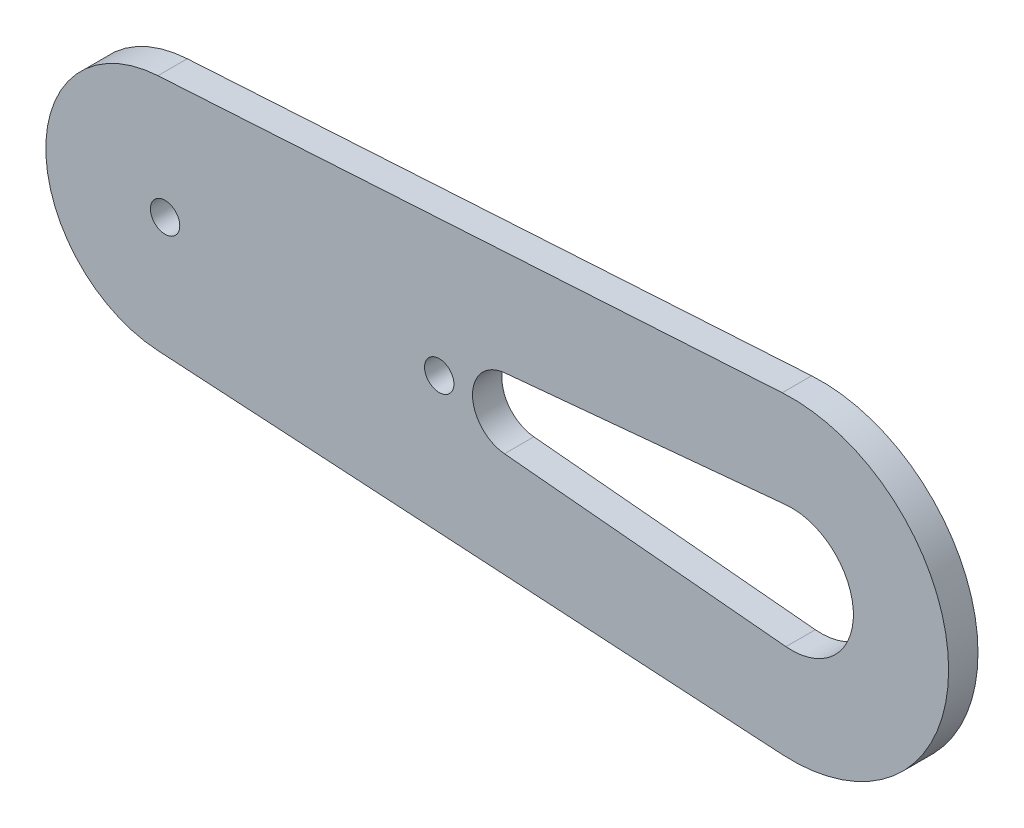
ISO-10303-21;
HEADER;
FILE_DESCRIPTION(('STEP AP214'),'2;1');
FILE_NAME('part.step','',(''),(''),'','','');
FILE_SCHEMA(('AUTOMOTIVE_DESIGN { 1 0 10303 214 1 1 1 1 }'));
ENDSEC;
DATA;
#1=APPLICATION_CONTEXT('core data for automotive mechanical design processes');
#2=APPLICATION_PROTOCOL_DEFINITION('international standard','automotive_design',2000,#1);
#3=PRODUCT_CONTEXT('',#1,'mechanical');
#4=PRODUCT('Part','Part','',(#3));
#5=PRODUCT_RELATED_PRODUCT_CATEGORY('part','',(#4));
#6=PRODUCT_DEFINITION_FORMATION('','',#4);
#7=PRODUCT_DEFINITION_CONTEXT('part definition',#1,'design');
#8=PRODUCT_DEFINITION('design','',#6,#7);
#9=PRODUCT_DEFINITION_SHAPE('','',#8);
#10=(LENGTH_UNIT() NAMED_UNIT(*) SI_UNIT(.MILLI.,.METRE.));
#11=(NAMED_UNIT(*) PLANE_ANGLE_UNIT() SI_UNIT($,.RADIAN.));
#12=(NAMED_UNIT(*) SI_UNIT($,.STERADIAN.) SOLID_ANGLE_UNIT());
#13=UNCERTAINTY_MEASURE_WITH_UNIT(LENGTH_MEASURE(1.E-05),#10,'distance_accuracy_value','');
#14=(GEOMETRIC_REPRESENTATION_CONTEXT(3) GLOBAL_UNCERTAINTY_ASSIGNED_CONTEXT((#13)) GLOBAL_UNIT_ASSIGNED_CONTEXT((#10,
#11,#12)) REPRESENTATION_CONTEXT('',''));
#15=CARTESIAN_POINT('',(0.,0.,0.));
#16=DIRECTION('',(0.,0.,1.));
#17=DIRECTION('',(1.,0.,0.));
#18=AXIS2_PLACEMENT_3D('',#15,#16,#17);
#19=CARTESIAN_POINT('',(47.1284914643076,-28.3132739904824,3.));
#20=DIRECTION('',(0.0601086862305752,0.998191838195261,0.));
#21=DIRECTION('',(-0.998191838195261,0.0601086862305752,0.));
#22=AXIS2_PLACEMENT_3D('',#19,#20,#21);
#23=PLANE('',#22);
#24=DIRECTION('',(0.998191838195261,-0.0601086862305752,0.));
#25=VECTOR('',#24,1.);
#26=CARTESIAN_POINT('',(47.1284914643076,-28.3132739904824,3.));
#27=LINE('',#26,#25);
#28=CARTESIAN_POINT('',(-16.640273069429,-24.4732739904824,3.));
#29=VERTEX_POINT('',#28);
#30=CARTESIAN_POINT('',(47.1284914643076,-28.3132739904824,3.));
#31=VERTEX_POINT('',#30);
#32=EDGE_CURVE('E120',#29,#31,#27,.T.);
#33=ORIENTED_EDGE('',*,*,#32,.F.);
#34=DIRECTION('',(0.,0.,-1.));
#35=VECTOR('',#34,1.);
#36=CARTESIAN_POINT('',(-16.640273069429,-24.4732739904824,3.));
#37=LINE('',#36,#35);
#38=CARTESIAN_POINT('',(-16.640273069429,-24.4732739904824,0.));
#39=VERTEX_POINT('',#38);
#40=EDGE_CURVE('E107',#29,#39,#37,.T.);
#41=ORIENTED_EDGE('',*,*,#40,.T.);
#42=DIRECTION('',(0.998191838195261,-0.0601086862305752,0.));
#43=VECTOR('',#42,1.);
#44=CARTESIAN_POINT('',(47.1284914643076,-28.3132739904824,0.));
#45=LINE('',#44,#43);
#46=CARTESIAN_POINT('',(47.1284914643076,-28.3132739904824,0.));
#47=VERTEX_POINT('',#46);
#48=EDGE_CURVE('E143',#39,#47,#45,.T.);
#49=ORIENTED_EDGE('',*,*,#48,.T.);
#50=DIRECTION('',(0.,0.,-1.));
#51=VECTOR('',#50,1.);
#52=CARTESIAN_POINT('',(47.1284914643076,-28.3132739904824,3.));
#53=LINE('',#52,#51);
#54=EDGE_CURVE('E11',#31,#47,#53,.T.);
#55=ORIENTED_EDGE('',*,*,#54,.F.);
#56=EDGE_LOOP('',(#33,#41,#49,#55));
#57=FACE_BOUND('',#56,.T.);
#58=ADVANCED_FACE('F44',(#57),#23,.F.);
#59=CARTESIAN_POINT('',(48.0919725737385,-12.3132739904824,3.));
#60=DIRECTION('',(0.,0.,-1.));
#61=DIRECTION('',(-1.,0.,0.));
#62=AXIS2_PLACEMENT_3D('',#59,#60,#61);
#63=CYLINDRICAL_SURFACE('',#62,16.02898299482);
#64=CARTESIAN_POINT('',(48.0919725737385,-12.3132739904824,0.));
#65=DIRECTION('',(0.,0.,1.));
#66=DIRECTION('',(-1.,0.,0.));
#67=AXIS2_PLACEMENT_3D('',#64,#65,#66);
#68=CIRCLE('',#67,16.02898299482);
#69=CARTESIAN_POINT('',(47.1284914643076,3.68672600951756,0.));
#70=VERTEX_POINT('',#69);
#71=EDGE_CURVE('E135',#47,#70,#68,.T.);
#72=ORIENTED_EDGE('',*,*,#71,.T.);
#73=DIRECTION('',(0.,0.,-1.));
#74=VECTOR('',#73,1.);
#75=CARTESIAN_POINT('',(47.1284914643076,3.68672600951756,3.));
#76=LINE('',#75,#74);
#77=CARTESIAN_POINT('',(47.1284914643076,3.68672600951756,3.));
#78=VERTEX_POINT('',#77);
#79=EDGE_CURVE('E52',#78,#70,#76,.T.);
#80=ORIENTED_EDGE('',*,*,#79,.F.);
#81=CARTESIAN_POINT('',(48.0919725737385,-12.3132739904824,3.));
#82=DIRECTION('',(0.,0.,1.));
#83=DIRECTION('',(-1.,0.,0.));
#84=AXIS2_PLACEMENT_3D('',#81,#82,#83);
#85=CIRCLE('',#84,16.02898299482);
#86=EDGE_CURVE('E128',#31,#78,#85,.T.);
#87=ORIENTED_EDGE('',*,*,#86,.F.);
#88=ORIENTED_EDGE('',*,*,#54,.T.);
#89=EDGE_LOOP('',(#72,#80,#87,#88));
#90=FACE_BOUND('',#89,.T.);
#91=ADVANCED_FACE('F237',(#90),#63,.T.);
#92=CARTESIAN_POINT('',(-52.5102031196558,-2.31327399048244,3.));
#93=DIRECTION('',(0.0601086862305751,-0.998191838195261,0.));
#94=DIRECTION('',(0.998191838195261,0.0601086862305751,0.));
#95=AXIS2_PLACEMENT_3D('',#92,#93,#94);
#96=PLANE('',#95);
#97=DIRECTION('',(-0.998191838195261,-0.0601086862305751,0.));
#98=VECTOR('',#97,1.);
#99=CARTESIAN_POINT('',(-52.5102031196558,-2.31327399048244,0.));
#100=LINE('',#99,#98);
#101=CARTESIAN_POINT('',(-16.640273069429,-0.15327399048244,0.));
#102=VERTEX_POINT('',#101);
#103=EDGE_CURVE('E129',#70,#102,#100,.T.);
#104=ORIENTED_EDGE('',*,*,#103,.T.);
#105=DIRECTION('',(0.,0.,-1.));
#106=VECTOR('',#105,1.);
#107=CARTESIAN_POINT('',(-16.640273069429,-0.15327399048244,3.));
#108=LINE('',#107,#106);
#109=CARTESIAN_POINT('',(-16.640273069429,-0.15327399048244,3.));
#110=VERTEX_POINT('',#109);
#111=EDGE_CURVE('E59',#110,#102,#108,.T.);
#112=ORIENTED_EDGE('',*,*,#111,.F.);
#113=DIRECTION('',(-0.998191838195261,-0.0601086862305751,0.));
#114=VECTOR('',#113,1.);
#115=CARTESIAN_POINT('',(-52.5102031196558,-2.31327399048244,3.));
#116=LINE('',#115,#114);
#117=EDGE_CURVE('E123',#78,#110,#116,.T.);
#118=ORIENTED_EDGE('',*,*,#117,.F.);
#119=ORIENTED_EDGE('',*,*,#79,.T.);
#120=EDGE_LOOP('',(#104,#112,#118,#119));
#121=FACE_BOUND('',#120,.T.);
#122=ADVANCED_FACE('F153',(#121),#96,.F.);
#123=CARTESIAN_POINT('',(-51.9080274262615,-12.3132739904824,3.));
#124=DIRECTION('',(0.,0.,-1.));
#125=DIRECTION('',(-1.,0.,0.));
#126=AXIS2_PLACEMENT_3D('',#123,#124,#125);
#127=PLANE('',#126);
#128=DIRECTION('',(0.995656440705901,-0.093103448275862,0.));
#129=VECTOR('',#128,1.);
#130=CARTESIAN_POINT('',(47.5054208496005,-18.5859095669296,3.));
#131=LINE('',#130,#129);
#132=CARTESIAN_POINT('',(18.7568001599454,-15.8976371770237,3.));
#133=VERTEX_POINT('',#132);
#134=CARTESIAN_POINT('',(47.5054208496005,-18.5859095669296,3.));
#135=VERTEX_POINT('',#134);
#136=EDGE_CURVE('E184',#133,#135,#131,.T.);
#137=ORIENTED_EDGE('',*,*,#136,.F.);
#138=CARTESIAN_POINT('',(19.0919725737385,-12.3132739904824,3.));
#139=DIRECTION('',(0.,0.,1.));
#140=DIRECTION('',(-1.,0.,0.));
#141=AXIS2_PLACEMENT_3D('',#138,#139,#140);
#142=CIRCLE('',#141,3.6);
#143=CARTESIAN_POINT('',(18.7568001599454,-8.72891080394119,3.));
#144=VERTEX_POINT('',#143);
#145=EDGE_CURVE('E67',#144,#133,#142,.T.);
#146=ORIENTED_EDGE('',*,*,#145,.F.);
#147=DIRECTION('',(-0.995656440705901,-0.0931034482758623,0.));
#148=VECTOR('',#147,1.);
#149=CARTESIAN_POINT('',(18.7568001599454,-8.72891080394119,3.));
#150=LINE('',#149,#148);
#151=CARTESIAN_POINT('',(47.5054208496005,-6.04063841403525,3.));
#152=VERTEX_POINT('',#151);
#153=EDGE_CURVE('E169',#152,#144,#150,.T.);
#154=ORIENTED_EDGE('',*,*,#153,.F.);
#155=CARTESIAN_POINT('',(48.0919725737385,-12.3132739904824,3.));
#156=DIRECTION('',(0.,0.,1.));
#157=DIRECTION('',(-1.,0.,0.));
#158=AXIS2_PLACEMENT_3D('',#155,#156,#157);
#159=CIRCLE('',#158,6.30000000000001);
#160=EDGE_CURVE('E189',#135,#152,#159,.T.);
#161=ORIENTED_EDGE('',*,*,#160,.F.);
#162=EDGE_LOOP('',(#137,#146,#154,#161));
#163=FACE_BOUND('',#162,.T.);
#164=CARTESIAN_POINT('',(12.0919725737385,-12.3132739904824,3.));
#165=DIRECTION('',(0.,0.,1.));
#166=DIRECTION('',(1.,0.,0.));
#167=AXIS2_PLACEMENT_3D('',#164,#165,#166);
#168=CIRCLE('',#167,1.5);
#169=CARTESIAN_POINT('',(13.5919725737385,-12.3132739904824,3.));
#170=VERTEX_POINT('',#169);
#171=EDGE_CURVE('E185',#170,#170,#168,.T.);
#172=ORIENTED_EDGE('',*,*,#171,.F.);
#173=EDGE_LOOP('',(#172));
#174=FACE_BOUND('',#173,.T.);
#175=CARTESIAN_POINT('',(-15.9080274262615,-12.3132739904824,3.));
#176=DIRECTION('',(0.,0.,1.));
#177=DIRECTION('',(1.,0.,0.));
#178=AXIS2_PLACEMENT_3D('',#175,#176,#177);
#179=CIRCLE('',#178,1.5);
#180=CARTESIAN_POINT('',(-14.4080274262615,-12.3132739904824,3.));
#181=VERTEX_POINT('',#180);
#182=EDGE_CURVE('E212',#181,#181,#179,.T.);
#183=ORIENTED_EDGE('',*,*,#182,.F.);
#184=EDGE_LOOP('',(#183));
#185=FACE_BOUND('',#184,.T.);
#186=ORIENTED_EDGE('',*,*,#117,.T.);
#187=CARTESIAN_POINT('',(-15.9080274262615,-12.3132739904824,3.));
#188=DIRECTION('',(0.,0.,1.));
#189=DIRECTION('',(1.,0.,0.));
#190=AXIS2_PLACEMENT_3D('',#187,#188,#189);
#191=CIRCLE('',#190,12.1820270760632);
#192=EDGE_CURVE('E110',#110,#29,#191,.T.);
#193=ORIENTED_EDGE('',*,*,#192,.T.);
#194=ORIENTED_EDGE('',*,*,#32,.T.);
#195=ORIENTED_EDGE('',*,*,#86,.T.);
#196=EDGE_LOOP('',(#186,#193,#194,#195));
#197=FACE_BOUND('',#196,.T.);
#198=ADVANCED_FACE('F119',(#163,#174,#185,#197),#127,.F.);
#199=CARTESIAN_POINT('',(-51.9080274262615,-12.3132739904824,0.));
#200=DIRECTION('',(0.,0.,-1.));
#201=DIRECTION('',(-1.,0.,0.));
#202=AXIS2_PLACEMENT_3D('',#199,#200,#201);
#203=PLANE('',#202);
#204=CARTESIAN_POINT('',(-15.9080274262615,-12.3132739904824,0.));
#205=DIRECTION('',(0.,0.,1.));
#206=DIRECTION('',(1.,0.,0.));
#207=AXIS2_PLACEMENT_3D('',#204,#205,#206);
#208=CIRCLE('',#207,12.1820270760632);
#209=EDGE_CURVE('E111',#102,#39,#208,.T.);
#210=ORIENTED_EDGE('',*,*,#209,.F.);
#211=ORIENTED_EDGE('',*,*,#103,.F.);
#212=ORIENTED_EDGE('',*,*,#71,.F.);
#213=ORIENTED_EDGE('',*,*,#48,.F.);
#214=EDGE_LOOP('',(#210,#211,#212,#213));
#215=FACE_BOUND('',#214,.T.);
#216=CARTESIAN_POINT('',(19.0919725737385,-12.3132739904824,0.));
#217=DIRECTION('',(0.,0.,1.));
#218=DIRECTION('',(-1.,0.,0.));
#219=AXIS2_PLACEMENT_3D('',#216,#217,#218);
#220=CIRCLE('',#219,3.6);
#221=CARTESIAN_POINT('',(18.7568001599454,-8.72891080394119,0.));
#222=VERTEX_POINT('',#221);
#223=CARTESIAN_POINT('',(18.7568001599454,-15.8976371770237,0.));
#224=VERTEX_POINT('',#223);
#225=EDGE_CURVE('E164',#222,#224,#220,.T.);
#226=ORIENTED_EDGE('',*,*,#225,.T.);
#227=DIRECTION('',(0.995656440705901,-0.093103448275862,0.));
#228=VECTOR('',#227,1.);
#229=CARTESIAN_POINT('',(47.5054208496005,-18.5859095669296,0.));
#230=LINE('',#229,#228);
#231=CARTESIAN_POINT('',(47.5054208496005,-18.5859095669296,0.));
#232=VERTEX_POINT('',#231);
#233=EDGE_CURVE('E168',#224,#232,#230,.T.);
#234=ORIENTED_EDGE('',*,*,#233,.T.);
#235=CARTESIAN_POINT('',(48.0919725737385,-12.3132739904824,0.));
#236=DIRECTION('',(0.,0.,1.));
#237=DIRECTION('',(-1.,0.,0.));
#238=AXIS2_PLACEMENT_3D('',#235,#236,#237);
#239=CIRCLE('',#238,6.30000000000001);
#240=CARTESIAN_POINT('',(47.5054208496005,-6.04063841403525,0.));
#241=VERTEX_POINT('',#240);
#242=EDGE_CURVE('E173',#232,#241,#239,.T.);
#243=ORIENTED_EDGE('',*,*,#242,.T.);
#244=DIRECTION('',(-0.995656440705901,-0.0931034482758623,0.));
#245=VECTOR('',#244,1.);
#246=CARTESIAN_POINT('',(18.7568001599454,-8.72891080394119,0.));
#247=LINE('',#246,#245);
#248=EDGE_CURVE('E177',#241,#222,#247,.T.);
#249=ORIENTED_EDGE('',*,*,#248,.T.);
#250=EDGE_LOOP('',(#226,#234,#243,#249));
#251=FACE_BOUND('',#250,.T.);
#252=CARTESIAN_POINT('',(12.0919725737385,-12.3132739904824,0.));
#253=DIRECTION('',(0.,0.,1.));
#254=DIRECTION('',(1.,0.,0.));
#255=AXIS2_PLACEMENT_3D('',#252,#253,#254);
#256=CIRCLE('',#255,1.5);
#257=CARTESIAN_POINT('',(13.5919725737385,-12.3132739904824,0.));
#258=VERTEX_POINT('',#257);
#259=EDGE_CURVE('E209',#258,#258,#256,.T.);
#260=ORIENTED_EDGE('',*,*,#259,.T.);
#261=EDGE_LOOP('',(#260));
#262=FACE_BOUND('',#261,.T.);
#263=CARTESIAN_POINT('',(-15.9080274262615,-12.3132739904824,0.));
#264=DIRECTION('',(0.,0.,1.));
#265=DIRECTION('',(1.,0.,0.));
#266=AXIS2_PLACEMENT_3D('',#263,#264,#265);
#267=CIRCLE('',#266,1.5);
#268=CARTESIAN_POINT('',(-14.4080274262615,-12.3132739904824,0.));
#269=VERTEX_POINT('',#268);
#270=EDGE_CURVE('E138',#269,#269,#267,.T.);
#271=ORIENTED_EDGE('',*,*,#270,.T.);
#272=EDGE_LOOP('',(#271));
#273=FACE_BOUND('',#272,.T.);
#274=ADVANCED_FACE('F157',(#215,#251,#262,#273),#203,.T.);
#275=CARTESIAN_POINT('',(-15.9080274262615,-12.3132739904824,0.));
#276=DIRECTION('',(0.,0.,1.));
#277=DIRECTION('',(1.,0.,0.));
#278=AXIS2_PLACEMENT_3D('',#275,#276,#277);
#279=CYLINDRICAL_SURFACE('',#278,1.5);
#280=ORIENTED_EDGE('',*,*,#270,.F.);
#281=EDGE_LOOP('',(#280));
#282=FACE_BOUND('',#281,.T.);
#283=ORIENTED_EDGE('',*,*,#182,.T.);
#284=EDGE_LOOP('',(#283));
#285=FACE_BOUND('',#284,.T.);
#286=ADVANCED_FACE('F222',(#282,#285),#279,.F.);
#287=CARTESIAN_POINT('',(12.0919725737385,-12.3132739904824,0.));
#288=DIRECTION('',(0.,0.,1.));
#289=DIRECTION('',(1.,0.,0.));
#290=AXIS2_PLACEMENT_3D('',#287,#288,#289);
#291=CYLINDRICAL_SURFACE('',#290,1.5);
#292=ORIENTED_EDGE('',*,*,#259,.F.);
#293=EDGE_LOOP('',(#292));
#294=FACE_BOUND('',#293,.T.);
#295=ORIENTED_EDGE('',*,*,#171,.T.);
#296=EDGE_LOOP('',(#295));
#297=FACE_BOUND('',#296,.T.);
#298=ADVANCED_FACE('F224',(#294,#297),#291,.F.);
#299=CARTESIAN_POINT('',(19.0919725737385,-12.3132739904824,0.));
#300=DIRECTION('',(0.,0.,1.));
#301=DIRECTION('',(1.,0.,0.));
#302=AXIS2_PLACEMENT_3D('',#299,#300,#301);
#303=CYLINDRICAL_SURFACE('',#302,3.6);
#304=ORIENTED_EDGE('',*,*,#145,.T.);
#305=DIRECTION('',(0.,0.,1.));
#306=VECTOR('',#305,1.);
#307=CARTESIAN_POINT('',(18.7568001599454,-15.8976371770237,0.));
#308=LINE('',#307,#306);
#309=EDGE_CURVE('E181',#224,#133,#308,.T.);
#310=ORIENTED_EDGE('',*,*,#309,.F.);
#311=ORIENTED_EDGE('',*,*,#225,.F.);
#312=DIRECTION('',(0.,0.,1.));
#313=VECTOR('',#312,1.);
#314=CARTESIAN_POINT('',(18.7568001599454,-8.72891080394119,0.));
#315=LINE('',#314,#313);
#316=EDGE_CURVE('E146',#222,#144,#315,.T.);
#317=ORIENTED_EDGE('',*,*,#316,.T.);
#318=EDGE_LOOP('',(#304,#310,#311,#317));
#319=FACE_BOUND('',#318,.T.);
#320=ADVANCED_FACE('F230',(#319),#303,.F.);
#321=CARTESIAN_POINT('',(18.7568001599454,-8.72891080394119,0.));
#322=DIRECTION('',(-0.0931034482758623,0.995656440705901,0.));
#323=DIRECTION('',(-0.995656440705901,-0.0931034482758623,0.));
#324=AXIS2_PLACEMENT_3D('',#321,#322,#323);
#325=PLANE('',#324);
#326=ORIENTED_EDGE('',*,*,#153,.T.);
#327=ORIENTED_EDGE('',*,*,#316,.F.);
#328=ORIENTED_EDGE('',*,*,#248,.F.);
#329=DIRECTION('',(0.,0.,1.));
#330=VECTOR('',#329,1.);
#331=CARTESIAN_POINT('',(47.5054208496005,-6.04063841403525,0.));
#332=LINE('',#331,#330);
#333=EDGE_CURVE('E198',#241,#152,#332,.T.);
#334=ORIENTED_EDGE('',*,*,#333,.T.);
#335=EDGE_LOOP('',(#326,#327,#328,#334));
#336=FACE_BOUND('',#335,.T.);
#337=ADVANCED_FACE('F264',(#336),#325,.F.);
#338=CARTESIAN_POINT('',(48.0919725737385,-12.3132739904824,0.));
#339=DIRECTION('',(0.,0.,1.));
#340=DIRECTION('',(1.,0.,0.));
#341=AXIS2_PLACEMENT_3D('',#338,#339,#340);
#342=CYLINDRICAL_SURFACE('',#341,6.30000000000001);
#343=ORIENTED_EDGE('',*,*,#160,.T.);
#344=ORIENTED_EDGE('',*,*,#333,.F.);
#345=ORIENTED_EDGE('',*,*,#242,.F.);
#346=DIRECTION('',(0.,0.,1.));
#347=VECTOR('',#346,1.);
#348=CARTESIAN_POINT('',(47.5054208496005,-18.5859095669296,0.));
#349=LINE('',#348,#347);
#350=EDGE_CURVE('E201',#232,#135,#349,.T.);
#351=ORIENTED_EDGE('',*,*,#350,.T.);
#352=EDGE_LOOP('',(#343,#344,#345,#351));
#353=FACE_BOUND('',#352,.T.);
#354=ADVANCED_FACE('F266',(#353),#342,.F.);
#355=CARTESIAN_POINT('',(47.5054208496005,-18.5859095669296,0.));
#356=DIRECTION('',(-0.093103448275862,-0.995656440705901,0.));
#357=DIRECTION('',(0.995656440705901,-0.093103448275862,0.));
#358=AXIS2_PLACEMENT_3D('',#355,#356,#357);
#359=PLANE('',#358);
#360=ORIENTED_EDGE('',*,*,#136,.T.);
#361=ORIENTED_EDGE('',*,*,#350,.F.);
#362=ORIENTED_EDGE('',*,*,#233,.F.);
#363=ORIENTED_EDGE('',*,*,#309,.T.);
#364=EDGE_LOOP('',(#360,#361,#362,#363));
#365=FACE_BOUND('',#364,.T.);
#366=ADVANCED_FACE('F258',(#365),#359,.F.);
#367=CARTESIAN_POINT('',(-15.9080274262615,-12.3132739904824,3.));
#368=DIRECTION('',(0.,0.,-1.));
#369=DIRECTION('',(-1.,0.,0.));
#370=AXIS2_PLACEMENT_3D('',#367,#368,#369);
#371=CYLINDRICAL_SURFACE('',#370,12.1820270760632);
#372=ORIENTED_EDGE('',*,*,#209,.T.);
#373=ORIENTED_EDGE('',*,*,#40,.F.);
#374=ORIENTED_EDGE('',*,*,#192,.F.);
#375=ORIENTED_EDGE('',*,*,#111,.T.);
#376=EDGE_LOOP('',(#372,#373,#374,#375));
#377=FACE_BOUND('',#376,.T.);
#378=ADVANCED_FACE('F109',(#377),#371,.T.);
#379=CLOSED_SHELL('',(#58,#91,#122,#198,#274,#286,#298,#320,#337,#354,#366,#378));
#380=MANIFOLD_SOLID_BREP('B2',#379);
#381=ADVANCED_BREP_SHAPE_REPRESENTATION('',(#18,#380),#14);
#382=SHAPE_DEFINITION_REPRESENTATION(#9,#381);
ENDSEC;
END-ISO-10303-21;
